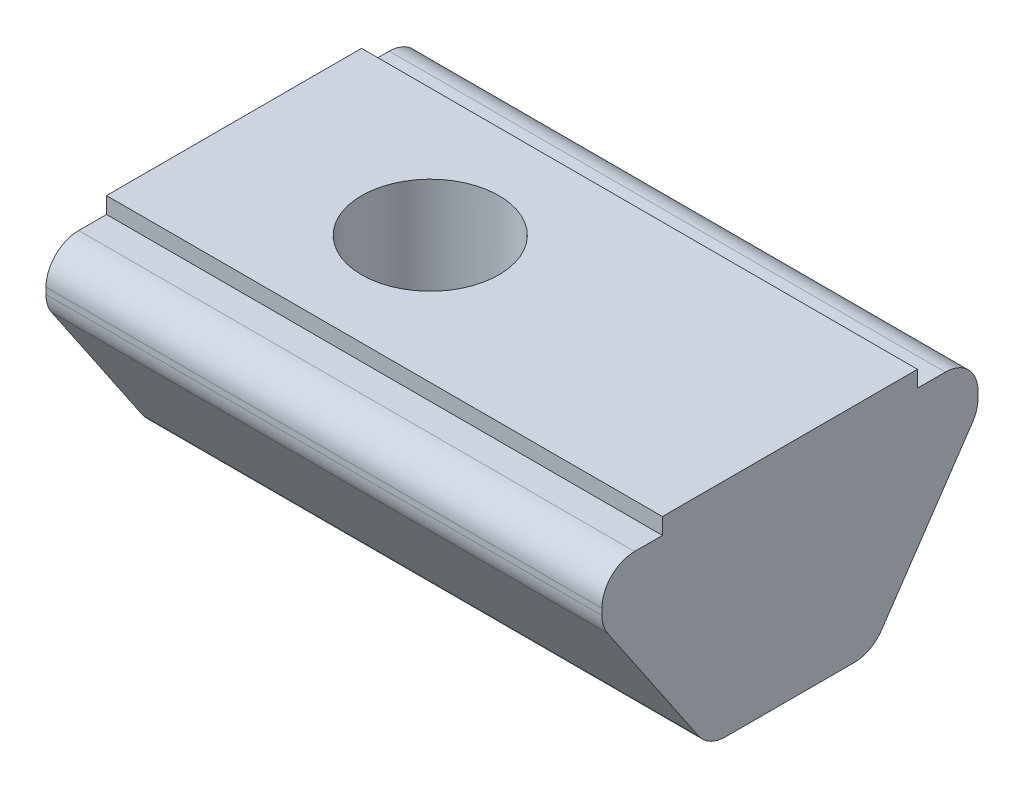
ISO-10303-21;
HEADER;
FILE_DESCRIPTION(('STEP AP214'),'2;1');
FILE_NAME('part.step','',(''),(''),'','','');
FILE_SCHEMA(('AUTOMOTIVE_DESIGN { 1 0 10303 214 1 1 1 1 }'));
ENDSEC;
DATA;
#1=APPLICATION_CONTEXT('core data for automotive mechanical design processes');
#2=APPLICATION_PROTOCOL_DEFINITION('international standard','automotive_design',2000,#1);
#3=PRODUCT_CONTEXT('',#1,'mechanical');
#4=PRODUCT('Part','Part','',(#3));
#5=PRODUCT_RELATED_PRODUCT_CATEGORY('part','',(#4));
#6=PRODUCT_DEFINITION_FORMATION('','',#4);
#7=PRODUCT_DEFINITION_CONTEXT('part definition',#1,'design');
#8=PRODUCT_DEFINITION('design','',#6,#7);
#9=PRODUCT_DEFINITION_SHAPE('','',#8);
#10=(LENGTH_UNIT() NAMED_UNIT(*) SI_UNIT(.MILLI.,.METRE.));
#11=(NAMED_UNIT(*) PLANE_ANGLE_UNIT() SI_UNIT($,.RADIAN.));
#12=(NAMED_UNIT(*) SI_UNIT($,.STERADIAN.) SOLID_ANGLE_UNIT());
#13=UNCERTAINTY_MEASURE_WITH_UNIT(LENGTH_MEASURE(1.E-05),#10,'distance_accuracy_value','');
#14=(GEOMETRIC_REPRESENTATION_CONTEXT(3) GLOBAL_UNCERTAINTY_ASSIGNED_CONTEXT((#13)) GLOBAL_UNIT_ASSIGNED_CONTEXT((#10,
#11,#12)) REPRESENTATION_CONTEXT('',''));
#15=CARTESIAN_POINT('',(0.,0.,0.));
#16=DIRECTION('',(0.,0.,1.));
#17=DIRECTION('',(1.,0.,0.));
#18=AXIS2_PLACEMENT_3D('',#15,#16,#17);
#19=CARTESIAN_POINT('',(11.,-6.8,2.5));
#20=DIRECTION('',(0.,1.,0.));
#21=DIRECTION('',(0.,0.,1.));
#22=AXIS2_PLACEMENT_3D('',#19,#20,#21);
#23=PLANE('',#22);
#24=DIRECTION('',(-1.,0.,0.));
#25=VECTOR('',#24,1.);
#26=CARTESIAN_POINT('',(11.,-6.8,1.96942367917667));
#27=LINE('',#26,#25);
#28=CARTESIAN_POINT('',(6.21786491667289,-6.8,1.96942367917667));
#29=VERTEX_POINT('',#28);
#30=CARTESIAN_POINT('',(0.728951556619648,-6.8,1.96942367917667));
#31=VERTEX_POINT('',#30);
#32=EDGE_CURVE('E199',#29,#31,#27,.T.);
#33=ORIENTED_EDGE('',*,*,#32,.T.);
#34=CARTESIAN_POINT('',(0.,-6.8,0.));
#35=DIRECTION('',(0.,1.,0.));
#36=DIRECTION('',(0.,0.,1.));
#37=AXIS2_PLACEMENT_3D('',#34,#35,#36);
#38=CIRCLE('',#37,2.1);
#39=CARTESIAN_POINT('',(0.728951556619638,-6.8,-1.96942367917668));
#40=VERTEX_POINT('',#39);
#41=EDGE_CURVE('E56',#31,#40,#38,.T.);
#42=ORIENTED_EDGE('',*,*,#41,.T.);
#43=DIRECTION('',(-1.,0.,0.));
#44=VECTOR('',#43,1.);
#45=CARTESIAN_POINT('',(11.,-6.8,-1.96942367917668));
#46=LINE('',#45,#44);
#47=CARTESIAN_POINT('',(6.2178649166729,-6.8,-1.96942367917668));
#48=VERTEX_POINT('',#47);
#49=EDGE_CURVE('E63',#40,#48,#46,.F.);
#50=ORIENTED_EDGE('',*,*,#49,.T.);
#51=CARTESIAN_POINT('',(7.5,-6.8,0.));
#52=DIRECTION('',(0.,1.,0.));
#53=DIRECTION('',(0.,0.,1.));
#54=AXIS2_PLACEMENT_3D('',#51,#52,#53);
#55=CIRCLE('',#54,2.35);
#56=EDGE_CURVE('E331',#48,#29,#55,.T.);
#57=ORIENTED_EDGE('',*,*,#56,.T.);
#58=EDGE_LOOP('',(#33,#42,#50,#57));
#59=FACE_BOUND('',#58,.T.);
#60=ADVANCED_FACE('F36',(#59),#23,.F.);
#61=CARTESIAN_POINT('',(7.5,-6.6,0.));
#62=DIRECTION('',(0.,-1.,0.));
#63=DIRECTION('',(0.,0.,-1.));
#64=AXIS2_PLACEMENT_3D('',#61,#62,#63);
#65=PLANE('',#64);
#66=CARTESIAN_POINT('',(7.5,-6.6,0.));
#67=DIRECTION('',(0.,1.,0.));
#68=DIRECTION('',(0.,0.,1.));
#69=AXIS2_PLACEMENT_3D('',#66,#67,#68);
#70=CIRCLE('',#69,2.35);
#71=CARTESIAN_POINT('',(7.5,-6.6,2.35));
#72=VERTEX_POINT('',#71);
#73=EDGE_CURVE('E440',#72,#72,#70,.T.);
#74=ORIENTED_EDGE('',*,*,#73,.F.);
#75=EDGE_LOOP('',(#74));
#76=FACE_BOUND('',#75,.T.);
#77=CARTESIAN_POINT('',(7.5,-6.6,0.));
#78=DIRECTION('',(0.,1.,0.));
#79=DIRECTION('',(0.,0.,1.));
#80=AXIS2_PLACEMENT_3D('',#77,#78,#79);
#81=CIRCLE('',#80,1.98997487421324);
#82=CARTESIAN_POINT('',(7.5,-6.6,1.98997487421324));
#83=VERTEX_POINT('',#82);
#84=EDGE_CURVE('E437',#83,#83,#81,.T.);
#85=ORIENTED_EDGE('',*,*,#84,.T.);
#86=EDGE_LOOP('',(#85));
#87=FACE_BOUND('',#86,.T.);
#88=ADVANCED_FACE('F243',(#76,#87),#65,.T.);
#89=CARTESIAN_POINT('',(-6.,-6.8,-1.96942367917668));
#90=VERTEX_POINT('',#89);
#91=CARTESIAN_POINT('',(-0.728951556619638,-6.8,-1.96942367917668));
#92=VERTEX_POINT('',#91);
#93=EDGE_CURVE('E192',#90,#92,#46,.F.);
#94=ORIENTED_EDGE('',*,*,#93,.T.);
#95=CARTESIAN_POINT('',(-0.728951556619647,-6.8,1.96942367917667));
#96=VERTEX_POINT('',#95);
#97=EDGE_CURVE('E179',#92,#96,#38,.T.);
#98=ORIENTED_EDGE('',*,*,#97,.T.);
#99=CARTESIAN_POINT('',(-6.,-6.8,1.96942367917667));
#100=VERTEX_POINT('',#99);
#101=EDGE_CURVE('E189',#96,#100,#27,.T.);
#102=ORIENTED_EDGE('',*,*,#101,.T.);
#103=DIRECTION('',(0.,0.,-1.));
#104=VECTOR('',#103,1.);
#105=CARTESIAN_POINT('',(-6.,-6.8,2.5));
#106=LINE('',#105,#104);
#107=EDGE_CURVE('E400',#100,#90,#106,.T.);
#108=ORIENTED_EDGE('',*,*,#107,.T.);
#109=EDGE_LOOP('',(#94,#98,#102,#108));
#110=FACE_BOUND('',#109,.T.);
#111=ADVANCED_FACE('F187',(#110),#23,.F.);
#112=CARTESIAN_POINT('',(8.78213508332711,-6.8,1.96942367917667));
#113=VERTEX_POINT('',#112);
#114=CARTESIAN_POINT('',(8.78213508332711,-6.8,-1.96942367917668));
#115=VERTEX_POINT('',#114);
#116=EDGE_CURVE('E258',#113,#115,#55,.T.);
#117=ORIENTED_EDGE('',*,*,#116,.T.);
#118=CARTESIAN_POINT('',(11.,-6.8,-1.96942367917668));
#119=VERTEX_POINT('',#118);
#120=EDGE_CURVE('E203',#115,#119,#46,.F.);
#121=ORIENTED_EDGE('',*,*,#120,.T.);
#122=DIRECTION('',(0.,0.,-1.));
#123=VECTOR('',#122,1.);
#124=CARTESIAN_POINT('',(11.,-6.8,2.5));
#125=LINE('',#124,#123);
#126=CARTESIAN_POINT('',(11.,-6.8,1.96942367917667));
#127=VERTEX_POINT('',#126);
#128=EDGE_CURVE('E422',#127,#119,#125,.T.);
#129=ORIENTED_EDGE('',*,*,#128,.F.);
#130=EDGE_CURVE('E201',#127,#113,#27,.T.);
#131=ORIENTED_EDGE('',*,*,#130,.T.);
#132=EDGE_LOOP('',(#117,#121,#129,#131));
#133=FACE_BOUND('',#132,.T.);
#134=ADVANCED_FACE('F265',(#133),#23,.F.);
#135=CARTESIAN_POINT('',(11.,-5.8,1.96942367917667));
#136=DIRECTION('',(-1.,0.,0.));
#137=DIRECTION('',(0.,0.,1.));
#138=AXIS2_PLACEMENT_3D('',#135,#136,#137);
#139=CYLINDRICAL_SURFACE('',#138,1.);
#140=CARTESIAN_POINT('',(0.728951556619647,-6.8,1.96942367917667));
#141=CARTESIAN_POINT('',(0.672935465835495,-6.79996530631474,1.99016374762937));
#142=CARTESIAN_POINT('',(0.616037933516385,-6.79935348636729,2.00849966619249));
#143=CARTESIAN_POINT('',(0.500899644158275,-6.79762408197144,2.04025945838146));
#144=CARTESIAN_POINT('',(0.442659000860356,-6.79650654020182,2.05368374633576));
#145=CARTESIAN_POINT('',(0.326950166706323,-6.79444435326376,2.07520286302834));
#146=CARTESIAN_POINT('',(0.26950869295189,-6.79349562823857,2.08344119669412));
#147=CARTESIAN_POINT('',(0.154137028651653,-6.79208454773757,2.09513802387611));
#148=CARTESIAN_POINT('',(0.0962068494693398,-6.7916221809841,2.09859662822514));
#149=CARTESIAN_POINT('',(-0.0259141704767972,-6.79133118953696,2.10081961048391));
#150=CARTESIAN_POINT('',(-0.0901157696089263,-6.79157517518787,2.09904577032083));
#151=CARTESIAN_POINT('',(-0.218088839083341,-6.79275984182312,2.08963062205852));
#152=CARTESIAN_POINT('',(-0.281860209446964,-6.79370067947488,2.0819879945145));
#153=CARTESIAN_POINT('',(-0.41053849109129,-6.79590025889825,2.06054606201235));
#154=CARTESIAN_POINT('',(-0.475413111661064,-6.79716849321441,2.04655132869077));
#155=CARTESIAN_POINT('',(-0.571497719587722,-6.79870415543792,2.02101217373445));
#156=CARTESIAN_POINT('',(-0.603324556930379,-6.79915495528457,2.01174010006364));
#157=CARTESIAN_POINT('',(-0.666506940075597,-6.79980173585102,1.99169941730042));
#158=CARTESIAN_POINT('',(-0.697862472864068,-6.79999770954705,1.98093076696699));
#159=CARTESIAN_POINT('',(-0.728951556619647,-6.8,1.96942367917667));
#160=B_SPLINE_CURVE_WITH_KNOTS('',3,(#140,#141,#142,#143,#144,#145,#146,#147,#148,#149,#150,
#151,#152,#153,#154,#155,#156,#157,#158,#159),.UNSPECIFIED.,.F.,.F.,(4,2,2,2,2,2,2,2,2,4),(0.,
0.17913042420082,0.358245734082304,0.532157235250589,0.706064703674494,0.89846304078135,
1.09090464633829,1.28971660304698,1.38914289704332,1.48857193146393),.UNSPECIFIED.);
#161=EDGE_CURVE('E11',#31,#96,#160,.T.);
#162=ORIENTED_EDGE('',*,*,#161,.F.);
#163=ORIENTED_EDGE('',*,*,#32,.F.);
#164=CARTESIAN_POINT('',(6.21786491667289,-6.8,1.96942367917667));
#165=CARTESIAN_POINT('',(6.26941318028583,-6.7999783844694,2.00298939808445));
#166=CARTESIAN_POINT('',(6.32224458318778,-6.79831126791625,2.03449549383473));
#167=CARTESIAN_POINT('',(6.43007862404965,-6.79275195363107,2.09320956487121));
#168=CARTESIAN_POINT('',(6.48507930074782,-6.78886172476835,2.12042131620777));
#169=CARTESIAN_POINT('',(6.5970877665072,-6.77990723325075,2.17048964551508));
#170=CARTESIAN_POINT('',(6.65410018896922,-6.77484008688757,2.19333527072562));
#171=CARTESIAN_POINT('',(6.76973175574506,-6.76446242630606,2.2344965080788));
#172=CARTESIAN_POINT('',(6.8283512969707,-6.75915185174641,2.25281098975878));
#173=CARTESIAN_POINT('',(6.94888236347479,-6.74894438318208,2.28534355804725));
#174=CARTESIAN_POINT('',(7.01083836093298,-6.74406733563983,2.2994036657394));
#175=CARTESIAN_POINT('',(7.13577445922008,-6.7356860995647,2.32247152961866));
#176=CARTESIAN_POINT('',(7.19875446874625,-6.73218178932764,2.33147973372814));
#177=CARTESIAN_POINT('',(7.32518942022166,-6.72708124782143,2.34434859910167));
#178=CARTESIAN_POINT('',(7.38864313554109,-6.72548114986431,2.34821969361303));
#179=CARTESIAN_POINT('',(7.51567264327854,-6.72441846070776,2.3508062192578));
#180=CARTESIAN_POINT('',(7.57924843186728,-6.72495580352003,2.34952180955486));
#181=CARTESIAN_POINT('',(7.70530115923049,-6.72806792073519,2.34185667215855));
#182=CARTESIAN_POINT('',(7.76778230964222,-6.73061909717194,2.33553496314835));
#183=CARTESIAN_POINT('',(7.89195507478734,-6.73735308657264,2.31793111965888));
#184=CARTESIAN_POINT('',(7.95364659668612,-6.7415360895992,2.30664840734065));
#185=CARTESIAN_POINT('',(8.07590856167561,-6.75091949811049,2.27920115174183));
#186=CARTESIAN_POINT('',(8.13647799826114,-6.75612077279214,2.26303243130898));
#187=CARTESIAN_POINT('',(8.25611724410548,-6.76673811469897,2.22591828035103));
#188=CARTESIAN_POINT('',(8.31518681755857,-6.77215421535994,2.20497210382764));
#189=CARTESIAN_POINT('',(8.44469791533054,-6.78341725801903,2.15312433078792));
#190=CARTESIAN_POINT('',(8.51469137103973,-6.78908479370067,2.1210426216326));
#191=CARTESIAN_POINT('',(8.61707529883293,-6.79530060779581,2.06787787527475));
#192=CARTESIAN_POINT('',(8.65073584952602,-6.7969910668464,2.04933742726959));
#193=CARTESIAN_POINT('',(8.71714378257571,-6.79933946190278,2.01060666694317));
#194=CARTESIAN_POINT('',(8.74989087413197,-6.79999707270366,1.99041583708332));
#195=CARTESIAN_POINT('',(8.78213508332711,-6.8,1.96942367917667));
#196=B_SPLINE_CURVE_WITH_KNOTS('',3,(#164,#165,#166,#167,#168,#169,#170,#171,#172,#173,#174,
#175,#176,#177,#178,#179,#180,#181,#182,#183,#184,#185,#186,#187,#188,#189,#190,#191,#192,#193,
#194,#195),.UNSPECIFIED.,.F.,.F.,(4,2,2,2,2,2,2,2,2,2,2,2,2,2,2,4),(0.,0.184403443390736,
0.368643824911096,0.553340489318994,0.738083186833674,0.929021574559149,1.11994303023136,
1.31047613621604,1.50100335999993,1.6893305568292,1.87767969511312,2.06619031483349,
2.25473039060528,2.4858939519129,2.6012403850413,2.71662312913064),.UNSPECIFIED.);
#197=EDGE_CURVE('E249',#29,#113,#196,.T.);
#198=ORIENTED_EDGE('',*,*,#197,.T.);
#199=ORIENTED_EDGE('',*,*,#130,.F.);
#200=CARTESIAN_POINT('',(11.,-5.8,1.96942367917667));
#201=DIRECTION('',(1.,0.,0.));
#202=DIRECTION('',(0.,0.,-1.));
#203=AXIS2_PLACEMENT_3D('',#200,#201,#202);
#204=CIRCLE('',#203,1.);
#205=CARTESIAN_POINT('',(11.,-6.36065740956309,2.79747154560832));
#206=VERTEX_POINT('',#205);
#207=EDGE_CURVE('E346',#206,#127,#204,.T.);
#208=ORIENTED_EDGE('',*,*,#207,.F.);
#209=DIRECTION('',(-1.,0.,0.));
#210=VECTOR('',#209,1.);
#211=CARTESIAN_POINT('',(11.,-6.36065740956309,2.79747154560832));
#212=LINE('',#211,#210);
#213=CARTESIAN_POINT('',(-6.,-6.36065740956309,2.79747154560832));
#214=VERTEX_POINT('',#213);
#215=EDGE_CURVE('E338',#214,#206,#212,.F.);
#216=ORIENTED_EDGE('',*,*,#215,.F.);
#217=CARTESIAN_POINT('',(-6.,-5.8,1.96942367917667));
#218=DIRECTION('',(1.,0.,0.));
#219=DIRECTION('',(0.,0.,-1.));
#220=AXIS2_PLACEMENT_3D('',#217,#218,#219);
#221=CIRCLE('',#220,1.);
#222=EDGE_CURVE('E197',#100,#214,#221,.F.);
#223=ORIENTED_EDGE('',*,*,#222,.F.);
#224=ORIENTED_EDGE('',*,*,#101,.F.);
#225=EDGE_LOOP('',(#162,#163,#198,#199,#208,#216,#223,#224));
#226=FACE_BOUND('',#225,.T.);
#227=ADVANCED_FACE('F195',(#226),#139,.T.);
#228=CARTESIAN_POINT('',(11.,-5.8,-1.96942367917668));
#229=DIRECTION('',(-1.,0.,0.));
#230=DIRECTION('',(0.,0.,1.));
#231=AXIS2_PLACEMENT_3D('',#228,#229,#230);
#232=CYLINDRICAL_SURFACE('',#231,1.);
#233=CARTESIAN_POINT('',(-0.728951556619638,-6.8,-1.96942367917668));
#234=CARTESIAN_POINT('',(-0.672935465835485,-6.79996530631474,-1.99016374762937));
#235=CARTESIAN_POINT('',(-0.616037933516375,-6.79935348636729,-2.0084996661925));
#236=CARTESIAN_POINT('',(-0.500899644158265,-6.79762408197144,-2.04025945838146));
#237=CARTESIAN_POINT('',(-0.442659000860346,-6.79650654020182,-2.05368374633577));
#238=CARTESIAN_POINT('',(-0.326950166706313,-6.79444435326376,-2.07520286302834));
#239=CARTESIAN_POINT('',(-0.269508692951879,-6.79349562823857,-2.08344119669412));
#240=CARTESIAN_POINT('',(-0.154137028651643,-6.79208454773757,-2.09513802387611));
#241=CARTESIAN_POINT('',(-0.0962068494693293,-6.7916221809841,-2.09859662822514));
#242=CARTESIAN_POINT('',(0.0259141704768062,-6.79133118953696,-2.10081961048391));
#243=CARTESIAN_POINT('',(0.0901157696089336,-6.79157517518787,-2.09904577032083));
#244=CARTESIAN_POINT('',(0.218088839083345,-6.79275984182312,-2.08963062205853));
#245=CARTESIAN_POINT('',(0.281860209446966,-6.79370067947487,-2.0819879945145));
#246=CARTESIAN_POINT('',(0.410538491091289,-6.79590025889825,-2.06054606201236));
#247=CARTESIAN_POINT('',(0.475413111661062,-6.79716849321441,-2.04655132869077));
#248=CARTESIAN_POINT('',(0.571497719587717,-6.79870415543792,-2.02101217373445));
#249=CARTESIAN_POINT('',(0.603324556930373,-6.79915495528457,-2.01174010006364));
#250=CARTESIAN_POINT('',(0.66650694007559,-6.79980173585102,-1.99169941730042));
#251=CARTESIAN_POINT('',(0.697862472864059,-6.79999770954705,-1.980930766967));
#252=CARTESIAN_POINT('',(0.728951556619638,-6.8,-1.96942367917668));
#253=B_SPLINE_CURVE_WITH_KNOTS('',3,(#233,#234,#235,#236,#237,#238,#239,#240,#241,#242,#243,
#244,#245,#246,#247,#248,#249,#250,#251,#252),.UNSPECIFIED.,.F.,.F.,(4,2,2,2,2,2,2,2,2,4),(0.,
0.17913042420082,0.358245734082304,0.53215723525059,0.706064703674494,0.898463040781346,
1.09090464633828,1.28971660304697,1.3891428970433,1.48857193146391),.UNSPECIFIED.);
#254=EDGE_CURVE('E436',#92,#40,#253,.T.);
#255=ORIENTED_EDGE('',*,*,#254,.F.);
#256=ORIENTED_EDGE('',*,*,#93,.F.);
#257=CARTESIAN_POINT('',(-6.,-5.8,-1.96942367917668));
#258=DIRECTION('',(1.,0.,0.));
#259=DIRECTION('',(0.,0.,-1.));
#260=AXIS2_PLACEMENT_3D('',#257,#258,#259);
#261=CIRCLE('',#260,1.);
#262=CARTESIAN_POINT('',(-6.,-6.36065740956309,-2.79747154560832));
#263=VERTEX_POINT('',#262);
#264=EDGE_CURVE('E360',#263,#90,#261,.F.);
#265=ORIENTED_EDGE('',*,*,#264,.F.);
#266=DIRECTION('',(-1.,0.,0.));
#267=VECTOR('',#266,1.);
#268=CARTESIAN_POINT('',(11.,-6.36065740956309,-2.79747154560832));
#269=LINE('',#268,#267);
#270=CARTESIAN_POINT('',(11.,-6.36065740956309,-2.79747154560832));
#271=VERTEX_POINT('',#270);
#272=EDGE_CURVE('E211',#271,#263,#269,.T.);
#273=ORIENTED_EDGE('',*,*,#272,.F.);
#274=CARTESIAN_POINT('',(11.,-5.8,-1.96942367917668));
#275=DIRECTION('',(1.,0.,0.));
#276=DIRECTION('',(0.,0.,-1.));
#277=AXIS2_PLACEMENT_3D('',#274,#275,#276);
#278=CIRCLE('',#277,1.);
#279=EDGE_CURVE('E335',#119,#271,#278,.T.);
#280=ORIENTED_EDGE('',*,*,#279,.F.);
#281=ORIENTED_EDGE('',*,*,#120,.F.);
#282=CARTESIAN_POINT('',(8.7821350833271,-6.8,-1.96942367917668));
#283=CARTESIAN_POINT('',(8.73058681971416,-6.7999783844694,-2.00298939808445));
#284=CARTESIAN_POINT('',(8.67775541681221,-6.79831126791625,-2.03449549383474));
#285=CARTESIAN_POINT('',(8.56992137595034,-6.79275195363106,-2.09320956487121));
#286=CARTESIAN_POINT('',(8.51492069925218,-6.78886172476835,-2.12042131620777));
#287=CARTESIAN_POINT('',(8.40291223349279,-6.77990723325075,-2.17048964551508));
#288=CARTESIAN_POINT('',(8.34589981103077,-6.77484008688757,-2.19333527072562));
#289=CARTESIAN_POINT('',(8.23026824425493,-6.76446242630606,-2.23449650807881));
#290=CARTESIAN_POINT('',(8.17164870302929,-6.75915185174641,-2.25281098975878));
#291=CARTESIAN_POINT('',(8.0511176365252,-6.74894438318208,-2.28534355804725));
#292=CARTESIAN_POINT('',(7.98916163906701,-6.74406733563983,-2.2994036657394));
#293=CARTESIAN_POINT('',(7.8642255407799,-6.7356860995647,-2.32247152961866));
#294=CARTESIAN_POINT('',(7.80124553125374,-6.73218178932764,-2.33147973372814));
#295=CARTESIAN_POINT('',(7.67481057977833,-6.72708124782143,-2.34434859910167));
#296=CARTESIAN_POINT('',(7.6113568644589,-6.72548114986431,-2.34821969361303));
#297=CARTESIAN_POINT('',(7.48432735672145,-6.72441846070776,-2.35080621925781));
#298=CARTESIAN_POINT('',(7.42075156813271,-6.72495580352003,-2.34952180955486));
#299=CARTESIAN_POINT('',(7.2946988407695,-6.72806792073519,-2.34185667215855));
#300=CARTESIAN_POINT('',(7.23221769035777,-6.73061909717194,-2.33553496314835));
#301=CARTESIAN_POINT('',(7.10804492521265,-6.73735308657264,-2.31793111965888));
#302=CARTESIAN_POINT('',(7.04635340331387,-6.7415360895992,-2.30664840734065));
#303=CARTESIAN_POINT('',(6.92409143832438,-6.75091949811049,-2.27920115174182));
#304=CARTESIAN_POINT('',(6.86352200173885,-6.75612077279214,-2.26303243130898));
#305=CARTESIAN_POINT('',(6.74388275589451,-6.76673811469897,-2.22591828035102));
#306=CARTESIAN_POINT('',(6.68481318244142,-6.77215421535994,-2.20497210382763));
#307=CARTESIAN_POINT('',(6.55530208466945,-6.78341725801903,-2.15312433078791));
#308=CARTESIAN_POINT('',(6.48530862896026,-6.78908479370067,-2.1210426216326));
#309=CARTESIAN_POINT('',(6.38292470116707,-6.79530060779581,-2.06787787527475));
#310=CARTESIAN_POINT('',(6.34926415047398,-6.79699106684639,-2.0493374272696));
#311=CARTESIAN_POINT('',(6.2828562174243,-6.79933946190277,-2.01060666694317));
#312=CARTESIAN_POINT('',(6.25010912586804,-6.79999707270365,-1.99041583708332));
#313=CARTESIAN_POINT('',(6.2178649166729,-6.8,-1.96942367917668));
#314=B_SPLINE_CURVE_WITH_KNOTS('',3,(#282,#283,#284,#285,#286,#287,#288,#289,#290,#291,#292,
#293,#294,#295,#296,#297,#298,#299,#300,#301,#302,#303,#304,#305,#306,#307,#308,#309,#310,#311,
#312,#313),.UNSPECIFIED.,.F.,.F.,(4,2,2,2,2,2,2,2,2,2,2,2,2,2,2,4),(0.,0.184403443390735,
0.368643824911097,0.553340489318994,0.738083186833674,0.929021574559151,1.11994303023136,
1.31047613621604,1.50100335999993,1.6893305568292,1.87767969511312,2.06619031483349,
2.25473039060529,2.48589395191289,2.60124038504129,2.71662312913062),.UNSPECIFIED.);
#315=EDGE_CURVE('E50',#115,#48,#314,.T.);
#316=ORIENTED_EDGE('',*,*,#315,.T.);
#317=ORIENTED_EDGE('',*,*,#49,.F.);
#318=EDGE_LOOP('',(#255,#256,#265,#273,#280,#281,#316,#317));
#319=FACE_BOUND('',#318,.T.);
#320=ADVANCED_FACE('F234',(#319),#232,.T.);
#321=CARTESIAN_POINT('',(11.,-0.500000000000001,5.75));
#322=DIRECTION('',(0.,0.,-1.));
#323=DIRECTION('',(-1.,0.,0.));
#324=AXIS2_PLACEMENT_3D('',#321,#322,#323);
#325=PLANE('',#324);
#326=DIRECTION('',(0.,-1.,0.));
#327=VECTOR('',#326,1.);
#328=CARTESIAN_POINT('',(11.,-0.500000000000001,5.75));
#329=LINE('',#328,#327);
#330=CARTESIAN_POINT('',(11.,-1.5,5.75));
#331=VERTEX_POINT('',#330);
#332=CARTESIAN_POINT('',(11.,-1.69330266463017,5.75));
#333=VERTEX_POINT('',#332);
#334=EDGE_CURVE('E260',#331,#333,#329,.T.);
#335=ORIENTED_EDGE('',*,*,#334,.F.);
#336=DIRECTION('',(-1.,0.,0.));
#337=VECTOR('',#336,1.);
#338=CARTESIAN_POINT('',(11.,-1.5,5.75));
#339=LINE('',#338,#337);
#340=CARTESIAN_POINT('',(-6.,-1.5,5.75));
#341=VERTEX_POINT('',#340);
#342=EDGE_CURVE('E366',#331,#341,#339,.T.);
#343=ORIENTED_EDGE('',*,*,#342,.T.);
#344=DIRECTION('',(0.,-1.,0.));
#345=VECTOR('',#344,1.);
#346=CARTESIAN_POINT('',(-6.,-0.500000000000001,5.75));
#347=LINE('',#346,#345);
#348=CARTESIAN_POINT('',(-6.,-1.69330266463017,5.75));
#349=VERTEX_POINT('',#348);
#350=EDGE_CURVE('E257',#341,#349,#347,.T.);
#351=ORIENTED_EDGE('',*,*,#350,.T.);
#352=DIRECTION('',(-1.,0.,0.));
#353=VECTOR('',#352,1.);
#354=CARTESIAN_POINT('',(11.,-1.69330266463017,5.75));
#355=LINE('',#354,#353);
#356=EDGE_CURVE('E369',#349,#333,#355,.F.);
#357=ORIENTED_EDGE('',*,*,#356,.T.);
#358=EDGE_LOOP('',(#335,#343,#351,#357));
#359=FACE_BOUND('',#358,.T.);
#360=ADVANCED_FACE('F277',(#359),#325,.F.);
#361=CARTESIAN_POINT('',(11.,-2.,5.75));
#362=DIRECTION('',(0.,0.560657409563094,-0.828047866431646));
#363=DIRECTION('',(0.,0.828047866431646,0.560657409563094));
#364=AXIS2_PLACEMENT_3D('',#361,#362,#363);
#365=PLANE('',#364);
#366=DIRECTION('',(0.,-0.828047866431646,-0.560657409563094));
#367=VECTOR('',#366,1.);
#368=CARTESIAN_POINT('',(11.,-2.,5.75));
#369=LINE('',#368,#367);
#370=CARTESIAN_POINT('',(11.,-2.25396007419326,5.57804786643165));
#371=VERTEX_POINT('',#370);
#372=EDGE_CURVE('E423',#371,#206,#369,.T.);
#373=ORIENTED_EDGE('',*,*,#372,.F.);
#374=DIRECTION('',(-1.,0.,0.));
#375=VECTOR('',#374,1.);
#376=CARTESIAN_POINT('',(11.,-2.25396007419326,5.57804786643165));
#377=LINE('',#376,#375);
#378=CARTESIAN_POINT('',(-6.,-2.25396007419326,5.57804786643165));
#379=VERTEX_POINT('',#378);
#380=EDGE_CURVE('E336',#371,#379,#377,.T.);
#381=ORIENTED_EDGE('',*,*,#380,.T.);
#382=DIRECTION('',(0.,-0.828047866431646,-0.560657409563094));
#383=VECTOR('',#382,1.);
#384=CARTESIAN_POINT('',(-6.,-2.,5.75));
#385=LINE('',#384,#383);
#386=EDGE_CURVE('E402',#379,#214,#385,.T.);
#387=ORIENTED_EDGE('',*,*,#386,.T.);
#388=ORIENTED_EDGE('',*,*,#215,.T.);
#389=EDGE_LOOP('',(#373,#381,#387,#388));
#390=FACE_BOUND('',#389,.T.);
#391=ADVANCED_FACE('F280',(#390),#365,.F.);
#392=CARTESIAN_POINT('',(11.,-6.8,-2.5));
#393=DIRECTION('',(0.,0.560657409563094,0.828047866431646));
#394=DIRECTION('',(0.,-0.828047866431646,0.560657409563094));
#395=AXIS2_PLACEMENT_3D('',#392,#393,#394);
#396=PLANE('',#395);
#397=DIRECTION('',(0.,0.828047866431646,-0.560657409563094));
#398=VECTOR('',#397,1.);
#399=CARTESIAN_POINT('',(11.,-6.8,-2.5));
#400=LINE('',#399,#398);
#401=CARTESIAN_POINT('',(11.,-2.25396007419326,-5.57804786643164));
#402=VERTEX_POINT('',#401);
#403=EDGE_CURVE('E420',#271,#402,#400,.T.);
#404=ORIENTED_EDGE('',*,*,#403,.F.);
#405=ORIENTED_EDGE('',*,*,#272,.T.);
#406=DIRECTION('',(0.,0.828047866431646,-0.560657409563094));
#407=VECTOR('',#406,1.);
#408=CARTESIAN_POINT('',(-6.,-6.8,-2.5));
#409=LINE('',#408,#407);
#410=CARTESIAN_POINT('',(-6.,-2.25396007419326,-5.57804786643164));
#411=VERTEX_POINT('',#410);
#412=EDGE_CURVE('E398',#263,#411,#409,.T.);
#413=ORIENTED_EDGE('',*,*,#412,.T.);
#414=DIRECTION('',(-1.,0.,0.));
#415=VECTOR('',#414,1.);
#416=CARTESIAN_POINT('',(11.,-2.25396007419326,-5.57804786643165));
#417=LINE('',#416,#415);
#418=EDGE_CURVE('E206',#411,#402,#417,.F.);
#419=ORIENTED_EDGE('',*,*,#418,.T.);
#420=EDGE_LOOP('',(#404,#405,#413,#419));
#421=FACE_BOUND('',#420,.T.);
#422=ADVANCED_FACE('F284',(#421),#396,.F.);
#423=CARTESIAN_POINT('',(11.,-2.,-5.75));
#424=DIRECTION('',(0.,0.,1.));
#425=DIRECTION('',(1.,0.,0.));
#426=AXIS2_PLACEMENT_3D('',#423,#424,#425);
#427=PLANE('',#426);
#428=DIRECTION('',(0.,1.,0.));
#429=VECTOR('',#428,1.);
#430=CARTESIAN_POINT('',(11.,-2.,-5.75));
#431=LINE('',#430,#429);
#432=CARTESIAN_POINT('',(11.,-1.69330266463017,-5.75));
#433=VERTEX_POINT('',#432);
#434=CARTESIAN_POINT('',(11.,-1.5,-5.75));
#435=VERTEX_POINT('',#434);
#436=EDGE_CURVE('E417',#433,#435,#431,.T.);
#437=ORIENTED_EDGE('',*,*,#436,.F.);
#438=DIRECTION('',(-1.,0.,0.));
#439=VECTOR('',#438,1.);
#440=CARTESIAN_POINT('',(11.,-1.69330266463017,-5.75));
#441=LINE('',#440,#439);
#442=CARTESIAN_POINT('',(-6.,-1.69330266463017,-5.75));
#443=VERTEX_POINT('',#442);
#444=EDGE_CURVE('E222',#433,#443,#441,.T.);
#445=ORIENTED_EDGE('',*,*,#444,.T.);
#446=DIRECTION('',(0.,1.,0.));
#447=VECTOR('',#446,1.);
#448=CARTESIAN_POINT('',(-6.,-2.,-5.75));
#449=LINE('',#448,#447);
#450=CARTESIAN_POINT('',(-6.,-1.5,-5.75));
#451=VERTEX_POINT('',#450);
#452=EDGE_CURVE('E395',#443,#451,#449,.T.);
#453=ORIENTED_EDGE('',*,*,#452,.T.);
#454=DIRECTION('',(-1.,0.,0.));
#455=VECTOR('',#454,1.);
#456=CARTESIAN_POINT('',(11.,-1.5,-5.75));
#457=LINE('',#456,#455);
#458=EDGE_CURVE('E218',#451,#435,#457,.F.);
#459=ORIENTED_EDGE('',*,*,#458,.T.);
#460=EDGE_LOOP('',(#437,#445,#453,#459));
#461=FACE_BOUND('',#460,.T.);
#462=ADVANCED_FACE('F290',(#461),#427,.F.);
#463=CARTESIAN_POINT('',(11.,-0.499999999999999,-5.75));
#464=DIRECTION('',(0.,-1.,0.));
#465=DIRECTION('',(0.,0.,-1.));
#466=AXIS2_PLACEMENT_3D('',#463,#464,#465);
#467=PLANE('',#466);
#468=DIRECTION('',(0.,0.,1.));
#469=VECTOR('',#468,1.);
#470=CARTESIAN_POINT('',(11.,-0.499999999999999,-5.75));
#471=LINE('',#470,#469);
#472=CARTESIAN_POINT('',(11.,-0.499999999999999,-4.75));
#473=VERTEX_POINT('',#472);
#474=CARTESIAN_POINT('',(11.,-0.499999999999999,-3.9));
#475=VERTEX_POINT('',#474);
#476=EDGE_CURVE('E415',#473,#475,#471,.T.);
#477=ORIENTED_EDGE('',*,*,#476,.F.);
#478=DIRECTION('',(-1.,0.,0.));
#479=VECTOR('',#478,1.);
#480=CARTESIAN_POINT('',(11.,-0.499999999999999,-4.75));
#481=LINE('',#480,#479);
#482=CARTESIAN_POINT('',(-6.,-0.499999999999999,-4.75));
#483=VERTEX_POINT('',#482);
#484=EDGE_CURVE('E225',#473,#483,#481,.T.);
#485=ORIENTED_EDGE('',*,*,#484,.T.);
#486=DIRECTION('',(0.,0.,1.));
#487=VECTOR('',#486,1.);
#488=CARTESIAN_POINT('',(-6.,-0.499999999999999,-5.75));
#489=LINE('',#488,#487);
#490=CARTESIAN_POINT('',(-6.,-0.499999999999999,-3.9));
#491=VERTEX_POINT('',#490);
#492=EDGE_CURVE('E393',#483,#491,#489,.T.);
#493=ORIENTED_EDGE('',*,*,#492,.T.);
#494=DIRECTION('',(-1.,0.,0.));
#495=VECTOR('',#494,1.);
#496=CARTESIAN_POINT('',(11.,-0.499999999999999,-3.9));
#497=LINE('',#496,#495);
#498=EDGE_CURVE('E371',#475,#491,#497,.T.);
#499=ORIENTED_EDGE('',*,*,#498,.F.);
#500=EDGE_LOOP('',(#477,#485,#493,#499));
#501=FACE_BOUND('',#500,.T.);
#502=ADVANCED_FACE('F293',(#501),#467,.F.);
#503=CARTESIAN_POINT('',(11.,-0.499999999999999,-3.9));
#504=DIRECTION('',(0.,0.,1.));
#505=DIRECTION('',(1.,0.,0.));
#506=AXIS2_PLACEMENT_3D('',#503,#504,#505);
#507=PLANE('',#506);
#508=DIRECTION('',(0.,1.,0.));
#509=VECTOR('',#508,1.);
#510=CARTESIAN_POINT('',(-6.,-0.499999999999999,-3.9));
#511=LINE('',#510,#509);
#512=CARTESIAN_POINT('',(-6.,0.,-3.9));
#513=VERTEX_POINT('',#512);
#514=EDGE_CURVE('E391',#491,#513,#511,.T.);
#515=ORIENTED_EDGE('',*,*,#514,.T.);
#516=DIRECTION('',(-1.,0.,0.));
#517=VECTOR('',#516,1.);
#518=CARTESIAN_POINT('',(11.,0.,-3.9));
#519=LINE('',#518,#517);
#520=CARTESIAN_POINT('',(11.,0.,-3.9));
#521=VERTEX_POINT('',#520);
#522=EDGE_CURVE('E374',#521,#513,#519,.T.);
#523=ORIENTED_EDGE('',*,*,#522,.F.);
#524=DIRECTION('',(0.,1.,0.));
#525=VECTOR('',#524,1.);
#526=CARTESIAN_POINT('',(11.,-0.499999999999999,-3.9));
#527=LINE('',#526,#525);
#528=EDGE_CURVE('E413',#475,#521,#527,.T.);
#529=ORIENTED_EDGE('',*,*,#528,.F.);
#530=ORIENTED_EDGE('',*,*,#498,.T.);
#531=EDGE_LOOP('',(#515,#523,#529,#530));
#532=FACE_BOUND('',#531,.T.);
#533=ADVANCED_FACE('F297',(#532),#507,.F.);
#534=CARTESIAN_POINT('',(11.,0.,-3.9));
#535=DIRECTION('',(0.,-1.,0.));
#536=DIRECTION('',(0.,0.,-1.));
#537=AXIS2_PLACEMENT_3D('',#534,#535,#536);
#538=PLANE('',#537);
#539=CARTESIAN_POINT('',(0.,0.,0.));
#540=DIRECTION('',(0.,1.,0.));
#541=DIRECTION('',(0.,0.,1.));
#542=AXIS2_PLACEMENT_3D('',#539,#540,#541);
#543=CIRCLE('',#542,2.1);
#544=CARTESIAN_POINT('',(0.,0.,2.1));
#545=VERTEX_POINT('',#544);
#546=EDGE_CURVE('E193',#545,#545,#543,.T.);
#547=ORIENTED_EDGE('',*,*,#546,.F.);
#548=EDGE_LOOP('',(#547));
#549=FACE_BOUND('',#548,.T.);
#550=DIRECTION('',(0.,0.,1.));
#551=VECTOR('',#550,1.);
#552=CARTESIAN_POINT('',(-6.,0.,-3.9));
#553=LINE('',#552,#551);
#554=CARTESIAN_POINT('',(-6.,0.,3.9));
#555=VERTEX_POINT('',#554);
#556=EDGE_CURVE('E389',#513,#555,#553,.T.);
#557=ORIENTED_EDGE('',*,*,#556,.T.);
#558=DIRECTION('',(-1.,0.,0.));
#559=VECTOR('',#558,1.);
#560=CARTESIAN_POINT('',(11.,0.,3.9));
#561=LINE('',#560,#559);
#562=CARTESIAN_POINT('',(11.,0.,3.9));
#563=VERTEX_POINT('',#562);
#564=EDGE_CURVE('E377',#563,#555,#561,.T.);
#565=ORIENTED_EDGE('',*,*,#564,.F.);
#566=DIRECTION('',(0.,0.,1.));
#567=VECTOR('',#566,1.);
#568=CARTESIAN_POINT('',(11.,0.,-3.9));
#569=LINE('',#568,#567);
#570=EDGE_CURVE('E411',#521,#563,#569,.T.);
#571=ORIENTED_EDGE('',*,*,#570,.F.);
#572=ORIENTED_EDGE('',*,*,#522,.T.);
#573=EDGE_LOOP('',(#557,#565,#571,#572));
#574=FACE_BOUND('',#573,.T.);
#575=ADVANCED_FACE('F301',(#549,#574),#538,.F.);
#576=CARTESIAN_POINT('',(11.,0.,3.9));
#577=DIRECTION('',(0.,0.,-1.));
#578=DIRECTION('',(0.,1.,0.));
#579=AXIS2_PLACEMENT_3D('',#576,#577,#578);
#580=PLANE('',#579);
#581=DIRECTION('',(0.,-1.,0.));
#582=VECTOR('',#581,1.);
#583=CARTESIAN_POINT('',(-6.,0.,3.9));
#584=LINE('',#583,#582);
#585=CARTESIAN_POINT('',(-6.,-0.5,3.9));
#586=VERTEX_POINT('',#585);
#587=EDGE_CURVE('E387',#555,#586,#584,.T.);
#588=ORIENTED_EDGE('',*,*,#587,.T.);
#589=DIRECTION('',(-1.,0.,0.));
#590=VECTOR('',#589,1.);
#591=CARTESIAN_POINT('',(11.,-0.5,3.9));
#592=LINE('',#591,#590);
#593=CARTESIAN_POINT('',(11.,-0.5,3.9));
#594=VERTEX_POINT('',#593);
#595=EDGE_CURVE('E380',#594,#586,#592,.T.);
#596=ORIENTED_EDGE('',*,*,#595,.F.);
#597=DIRECTION('',(0.,-1.,0.));
#598=VECTOR('',#597,1.);
#599=CARTESIAN_POINT('',(11.,0.,3.9));
#600=LINE('',#599,#598);
#601=EDGE_CURVE('E409',#563,#594,#600,.T.);
#602=ORIENTED_EDGE('',*,*,#601,.F.);
#603=ORIENTED_EDGE('',*,*,#564,.T.);
#604=EDGE_LOOP('',(#588,#596,#602,#603));
#605=FACE_BOUND('',#604,.T.);
#606=ADVANCED_FACE('F305',(#605),#580,.F.);
#607=CARTESIAN_POINT('',(11.,-0.5,3.9));
#608=DIRECTION('',(0.,-1.,0.));
#609=DIRECTION('',(0.,0.,-1.));
#610=AXIS2_PLACEMENT_3D('',#607,#608,#609);
#611=PLANE('',#610);
#612=DIRECTION('',(0.,0.,1.));
#613=VECTOR('',#612,1.);
#614=CARTESIAN_POINT('',(-6.,-0.5,3.9));
#615=LINE('',#614,#613);
#616=CARTESIAN_POINT('',(-6.,-0.500000000000001,4.75));
#617=VERTEX_POINT('',#616);
#618=EDGE_CURVE('E384',#586,#617,#615,.T.);
#619=ORIENTED_EDGE('',*,*,#618,.T.);
#620=DIRECTION('',(-1.,0.,0.));
#621=VECTOR('',#620,1.);
#622=CARTESIAN_POINT('',(11.,-0.500000000000001,4.75));
#623=LINE('',#622,#621);
#624=CARTESIAN_POINT('',(11.,-0.500000000000001,4.75));
#625=VERTEX_POINT('',#624);
#626=EDGE_CURVE('E353',#617,#625,#623,.F.);
#627=ORIENTED_EDGE('',*,*,#626,.T.);
#628=DIRECTION('',(0.,0.,1.));
#629=VECTOR('',#628,1.);
#630=CARTESIAN_POINT('',(11.,-0.5,3.9));
#631=LINE('',#630,#629);
#632=EDGE_CURVE('E383',#594,#625,#631,.T.);
#633=ORIENTED_EDGE('',*,*,#632,.F.);
#634=ORIENTED_EDGE('',*,*,#595,.T.);
#635=EDGE_LOOP('',(#619,#627,#633,#634));
#636=FACE_BOUND('',#635,.T.);
#637=ADVANCED_FACE('F309',(#636),#611,.F.);
#638=CARTESIAN_POINT('',(11.,0.,0.));
#639=DIRECTION('',(1.,0.,0.));
#640=DIRECTION('',(0.,0.,-1.));
#641=AXIS2_PLACEMENT_3D('',#638,#639,#640);
#642=PLANE('',#641);
#643=ORIENTED_EDGE('',*,*,#632,.T.);
#644=CARTESIAN_POINT('',(11.,-1.5,4.75));
#645=DIRECTION('',(1.,0.,0.));
#646=DIRECTION('',(0.,0.,-1.));
#647=AXIS2_PLACEMENT_3D('',#644,#645,#646);
#648=CIRCLE('',#647,1.);
#649=EDGE_CURVE('E342',#625,#331,#648,.T.);
#650=ORIENTED_EDGE('',*,*,#649,.T.);
#651=ORIENTED_EDGE('',*,*,#334,.T.);
#652=CARTESIAN_POINT('',(11.,-1.69330266463017,4.75));
#653=DIRECTION('',(1.,0.,0.));
#654=DIRECTION('',(0.,0.,-1.));
#655=AXIS2_PLACEMENT_3D('',#652,#653,#654);
#656=CIRCLE('',#655,1.);
#657=EDGE_CURVE('E344',#333,#371,#656,.T.);
#658=ORIENTED_EDGE('',*,*,#657,.T.);
#659=ORIENTED_EDGE('',*,*,#372,.T.);
#660=ORIENTED_EDGE('',*,*,#207,.T.);
#661=ORIENTED_EDGE('',*,*,#128,.T.);
#662=ORIENTED_EDGE('',*,*,#279,.T.);
#663=ORIENTED_EDGE('',*,*,#403,.T.);
#664=CARTESIAN_POINT('',(11.,-1.69330266463017,-4.75));
#665=DIRECTION('',(1.,0.,0.));
#666=DIRECTION('',(0.,0.,-1.));
#667=AXIS2_PLACEMENT_3D('',#664,#665,#666);
#668=CIRCLE('',#667,1.);
#669=EDGE_CURVE('E349',#402,#433,#668,.T.);
#670=ORIENTED_EDGE('',*,*,#669,.T.);
#671=ORIENTED_EDGE('',*,*,#436,.T.);
#672=CARTESIAN_POINT('',(11.,-1.5,-4.75));
#673=DIRECTION('',(1.,0.,0.));
#674=DIRECTION('',(0.,0.,-1.));
#675=AXIS2_PLACEMENT_3D('',#672,#673,#674);
#676=CIRCLE('',#675,1.);
#677=EDGE_CURVE('E351',#435,#473,#676,.T.);
#678=ORIENTED_EDGE('',*,*,#677,.T.);
#679=ORIENTED_EDGE('',*,*,#476,.T.);
#680=ORIENTED_EDGE('',*,*,#528,.T.);
#681=ORIENTED_EDGE('',*,*,#570,.T.);
#682=ORIENTED_EDGE('',*,*,#601,.T.);
#683=EDGE_LOOP('',(#643,#650,#651,#658,#659,#660,#661,#662,#663,#670,#671,#678,#679,#680,#681,#682));
#684=FACE_BOUND('',#683,.T.);
#685=ADVANCED_FACE('F245',(#684),#642,.T.);
#686=CARTESIAN_POINT('',(-6.,0.,0.));
#687=DIRECTION('',(1.,0.,0.));
#688=DIRECTION('',(0.,0.,-1.));
#689=AXIS2_PLACEMENT_3D('',#686,#687,#688);
#690=PLANE('',#689);
#691=ORIENTED_EDGE('',*,*,#350,.F.);
#692=CARTESIAN_POINT('',(-6.,-1.5,4.75));
#693=DIRECTION('',(1.,0.,0.));
#694=DIRECTION('',(0.,0.,-1.));
#695=AXIS2_PLACEMENT_3D('',#692,#693,#694);
#696=CIRCLE('',#695,1.);
#697=EDGE_CURVE('E355',#341,#617,#696,.F.);
#698=ORIENTED_EDGE('',*,*,#697,.T.);
#699=ORIENTED_EDGE('',*,*,#618,.F.);
#700=ORIENTED_EDGE('',*,*,#587,.F.);
#701=ORIENTED_EDGE('',*,*,#556,.F.);
#702=ORIENTED_EDGE('',*,*,#514,.F.);
#703=ORIENTED_EDGE('',*,*,#492,.F.);
#704=CARTESIAN_POINT('',(-6.,-1.5,-4.75));
#705=DIRECTION('',(1.,0.,0.));
#706=DIRECTION('',(0.,0.,-1.));
#707=AXIS2_PLACEMENT_3D('',#704,#705,#706);
#708=CIRCLE('',#707,1.);
#709=EDGE_CURVE('E364',#483,#451,#708,.F.);
#710=ORIENTED_EDGE('',*,*,#709,.T.);
#711=ORIENTED_EDGE('',*,*,#452,.F.);
#712=CARTESIAN_POINT('',(-6.,-1.69330266463017,-4.75));
#713=DIRECTION('',(1.,0.,0.));
#714=DIRECTION('',(0.,0.,-1.));
#715=AXIS2_PLACEMENT_3D('',#712,#713,#714);
#716=CIRCLE('',#715,1.);
#717=EDGE_CURVE('E362',#443,#411,#716,.F.);
#718=ORIENTED_EDGE('',*,*,#717,.T.);
#719=ORIENTED_EDGE('',*,*,#412,.F.);
#720=ORIENTED_EDGE('',*,*,#264,.T.);
#721=ORIENTED_EDGE('',*,*,#107,.F.);
#722=ORIENTED_EDGE('',*,*,#222,.T.);
#723=ORIENTED_EDGE('',*,*,#386,.F.);
#724=CARTESIAN_POINT('',(-6.,-1.69330266463017,4.75));
#725=DIRECTION('',(1.,0.,0.));
#726=DIRECTION('',(0.,0.,-1.));
#727=AXIS2_PLACEMENT_3D('',#724,#725,#726);
#728=CIRCLE('',#727,1.);
#729=EDGE_CURVE('E357',#379,#349,#728,.F.);
#730=ORIENTED_EDGE('',*,*,#729,.T.);
#731=EDGE_LOOP('',(#691,#698,#699,#700,#701,#702,#703,#710,#711,#718,#719,#720,#721,#722,#723,#730));
#732=FACE_BOUND('',#731,.T.);
#733=ADVANCED_FACE('F275',(#732),#690,.F.);
#734=CARTESIAN_POINT('',(11.,-1.5,4.75));
#735=DIRECTION('',(-1.,0.,0.));
#736=DIRECTION('',(0.,0.,1.));
#737=AXIS2_PLACEMENT_3D('',#734,#735,#736);
#738=CYLINDRICAL_SURFACE('',#737,1.);
#739=ORIENTED_EDGE('',*,*,#649,.F.);
#740=ORIENTED_EDGE('',*,*,#626,.F.);
#741=ORIENTED_EDGE('',*,*,#697,.F.);
#742=ORIENTED_EDGE('',*,*,#342,.F.);
#743=EDGE_LOOP('',(#739,#740,#741,#742));
#744=FACE_BOUND('',#743,.T.);
#745=ADVANCED_FACE('F271',(#744),#738,.T.);
#746=CARTESIAN_POINT('',(11.,-1.69330266463017,4.75));
#747=DIRECTION('',(-1.,0.,0.));
#748=DIRECTION('',(0.,0.,1.));
#749=AXIS2_PLACEMENT_3D('',#746,#747,#748);
#750=CYLINDRICAL_SURFACE('',#749,1.);
#751=ORIENTED_EDGE('',*,*,#657,.F.);
#752=ORIENTED_EDGE('',*,*,#356,.F.);
#753=ORIENTED_EDGE('',*,*,#729,.F.);
#754=ORIENTED_EDGE('',*,*,#380,.F.);
#755=EDGE_LOOP('',(#751,#752,#753,#754));
#756=FACE_BOUND('',#755,.T.);
#757=ADVANCED_FACE('F266',(#756),#750,.T.);
#758=CARTESIAN_POINT('',(11.,-1.69330266463017,-4.75));
#759=DIRECTION('',(-1.,0.,0.));
#760=DIRECTION('',(0.,0.,1.));
#761=AXIS2_PLACEMENT_3D('',#758,#759,#760);
#762=CYLINDRICAL_SURFACE('',#761,1.);
#763=ORIENTED_EDGE('',*,*,#669,.F.);
#764=ORIENTED_EDGE('',*,*,#418,.F.);
#765=ORIENTED_EDGE('',*,*,#717,.F.);
#766=ORIENTED_EDGE('',*,*,#444,.F.);
#767=EDGE_LOOP('',(#763,#764,#765,#766));
#768=FACE_BOUND('',#767,.T.);
#769=ADVANCED_FACE('F270',(#768),#762,.T.);
#770=CARTESIAN_POINT('',(11.,-1.5,-4.75));
#771=DIRECTION('',(-1.,0.,0.));
#772=DIRECTION('',(0.,0.,1.));
#773=AXIS2_PLACEMENT_3D('',#770,#771,#772);
#774=CYLINDRICAL_SURFACE('',#773,1.);
#775=ORIENTED_EDGE('',*,*,#677,.F.);
#776=ORIENTED_EDGE('',*,*,#458,.F.);
#777=ORIENTED_EDGE('',*,*,#709,.F.);
#778=ORIENTED_EDGE('',*,*,#484,.F.);
#779=EDGE_LOOP('',(#775,#776,#777,#778));
#780=FACE_BOUND('',#779,.T.);
#781=ADVANCED_FACE('F38',(#780),#774,.T.);
#782=CARTESIAN_POINT('',(7.5,1.66554857329047,0.));
#783=DIRECTION('',(0.,1.,0.));
#784=DIRECTION('',(0.,0.,1.));
#785=AXIS2_PLACEMENT_3D('',#782,#783,#784);
#786=CYLINDRICAL_SURFACE('',#785,2.35);
#787=ORIENTED_EDGE('',*,*,#73,.T.);
#788=EDGE_LOOP('',(#787));
#789=FACE_BOUND('',#788,.T.);
#790=ORIENTED_EDGE('',*,*,#56,.F.);
#791=ORIENTED_EDGE('',*,*,#315,.F.);
#792=ORIENTED_EDGE('',*,*,#116,.F.);
#793=ORIENTED_EDGE('',*,*,#197,.F.);
#794=EDGE_LOOP('',(#790,#791,#792,#793));
#795=FACE_BOUND('',#794,.T.);
#796=ADVANCED_FACE('F236',(#789,#795),#786,.F.);
#797=CARTESIAN_POINT('',(7.5,-5.55,0.));
#798=DIRECTION('',(0.,1.,0.));
#799=DIRECTION('',(0.,0.,1.));
#800=AXIS2_PLACEMENT_3D('',#797,#798,#799);
#801=SPHERICAL_SURFACE('',#800,2.25);
#802=ORIENTED_EDGE('',*,*,#84,.F.);
#803=EDGE_LOOP('',(#802));
#804=FACE_BOUND('',#803,.T.);
#805=ADVANCED_FACE('F241',(#804),#801,.T.);
#806=CARTESIAN_POINT('',(0.,0.,0.));
#807=DIRECTION('',(0.,1.,0.));
#808=DIRECTION('',(0.,0.,1.));
#809=AXIS2_PLACEMENT_3D('',#806,#807,#808);
#810=CYLINDRICAL_SURFACE('',#809,2.1);
#811=ORIENTED_EDGE('',*,*,#254,.T.);
#812=ORIENTED_EDGE('',*,*,#41,.F.);
#813=ORIENTED_EDGE('',*,*,#161,.T.);
#814=ORIENTED_EDGE('',*,*,#97,.F.);
#815=EDGE_LOOP('',(#811,#812,#813,#814));
#816=FACE_BOUND('',#815,.T.);
#817=ORIENTED_EDGE('',*,*,#546,.T.);
#818=EDGE_LOOP('',(#817));
#819=FACE_BOUND('',#818,.T.);
#820=ADVANCED_FACE('F177',(#816,#819),#810,.F.);
#821=CLOSED_SHELL('',(#60,#88,#111,#134,#227,#320,#360,#391,#422,#462,#502,#533,#575,#606,#637,
#685,#733,#745,#757,#769,#781,#796,#805,#820));
#822=MANIFOLD_SOLID_BREP('B2',#821);
#823=ADVANCED_BREP_SHAPE_REPRESENTATION('',(#18,#822),#14);
#824=SHAPE_DEFINITION_REPRESENTATION(#9,#823);
ENDSEC;
END-ISO-10303-21;
